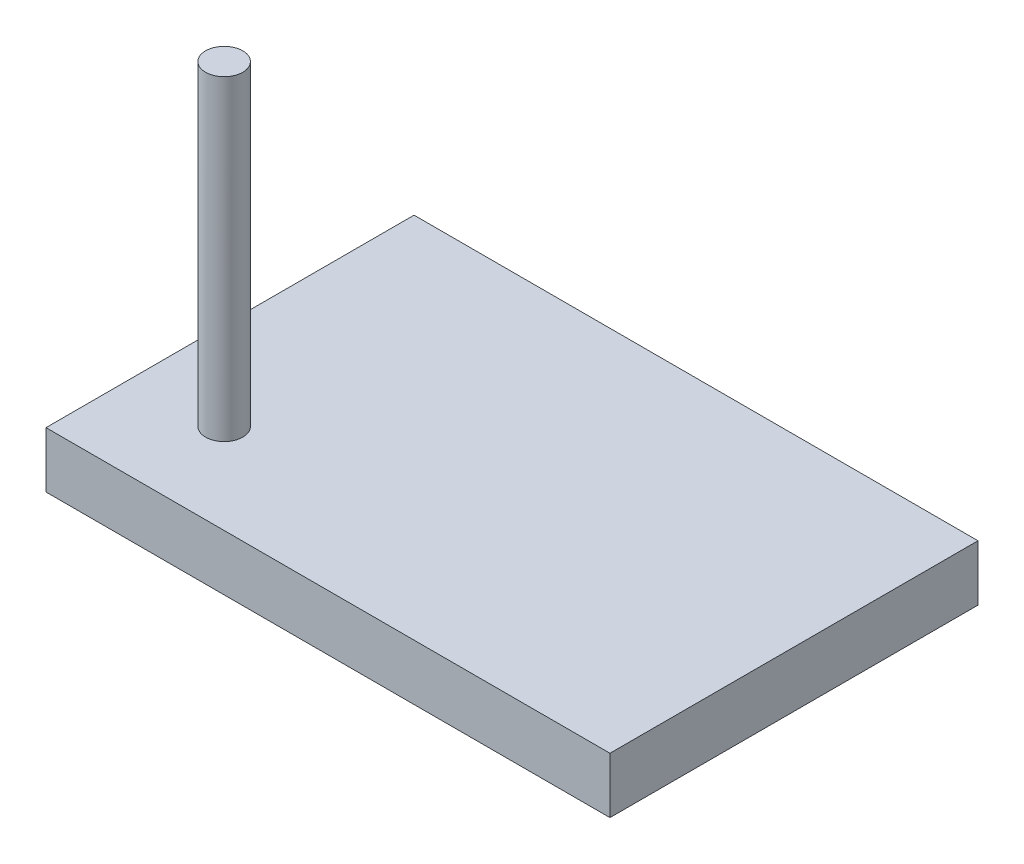
ISO-10303-21;
HEADER;
FILE_DESCRIPTION(('STEP AP214'),'2;1');
FILE_NAME('part.step','',(''),(''),'','','');
FILE_SCHEMA(('AUTOMOTIVE_DESIGN { 1 0 10303 214 1 1 1 1 }'));
ENDSEC;
DATA;
#1=APPLICATION_CONTEXT('core data for automotive mechanical design processes');
#2=APPLICATION_PROTOCOL_DEFINITION('international standard','automotive_design',2000,#1);
#3=PRODUCT_CONTEXT('',#1,'mechanical');
#4=PRODUCT('Part','Part','',(#3));
#5=PRODUCT_RELATED_PRODUCT_CATEGORY('part','',(#4));
#6=PRODUCT_DEFINITION_FORMATION('','',#4);
#7=PRODUCT_DEFINITION_CONTEXT('part definition',#1,'design');
#8=PRODUCT_DEFINITION('design','',#6,#7);
#9=PRODUCT_DEFINITION_SHAPE('','',#8);
#10=(LENGTH_UNIT() NAMED_UNIT(*) SI_UNIT(.MILLI.,.METRE.));
#11=(NAMED_UNIT(*) PLANE_ANGLE_UNIT() SI_UNIT($,.RADIAN.));
#12=(NAMED_UNIT(*) SI_UNIT($,.STERADIAN.) SOLID_ANGLE_UNIT());
#13=UNCERTAINTY_MEASURE_WITH_UNIT(LENGTH_MEASURE(1.E-05),#10,'distance_accuracy_value','');
#14=(GEOMETRIC_REPRESENTATION_CONTEXT(3) GLOBAL_UNCERTAINTY_ASSIGNED_CONTEXT((#13)) GLOBAL_UNIT_ASSIGNED_CONTEXT((#10,
#11,#12)) REPRESENTATION_CONTEXT('',''));
#15=CARTESIAN_POINT('',(0.,0.,0.));
#16=DIRECTION('',(0.,0.,1.));
#17=DIRECTION('',(1.,0.,0.));
#18=AXIS2_PLACEMENT_3D('',#15,#16,#17);
#19=CARTESIAN_POINT('',(75.8382381345163,15.,49.4928260918028));
#20=DIRECTION('',(-1.,0.,0.));
#21=DIRECTION('',(0.,0.,1.));
#22=AXIS2_PLACEMENT_3D('',#19,#20,#21);
#23=PLANE('',#22);
#24=DIRECTION('',(0.,0.,-1.));
#25=VECTOR('',#24,1.);
#26=CARTESIAN_POINT('',(75.8382381345163,0.,49.4928260918028));
#27=LINE('',#26,#25);
#28=CARTESIAN_POINT('',(75.8382381345163,0.,49.4928260918028));
#29=VERTEX_POINT('',#28);
#30=CARTESIAN_POINT('',(75.8382381345163,0.,-49.4928260918028));
#31=VERTEX_POINT('',#30);
#32=EDGE_CURVE('E99',#29,#31,#27,.T.);
#33=ORIENTED_EDGE('',*,*,#32,.T.);
#34=DIRECTION('',(0.,-1.,0.));
#35=VECTOR('',#34,1.);
#36=CARTESIAN_POINT('',(75.8382381345163,15.,-49.4928260918028));
#37=LINE('',#36,#35);
#38=CARTESIAN_POINT('',(75.8382381345163,15.,-49.4928260918028));
#39=VERTEX_POINT('',#38);
#40=EDGE_CURVE('E41',#39,#31,#37,.T.);
#41=ORIENTED_EDGE('',*,*,#40,.F.);
#42=DIRECTION('',(0.,0.,-1.));
#43=VECTOR('',#42,1.);
#44=CARTESIAN_POINT('',(75.8382381345163,15.,49.4928260918028));
#45=LINE('',#44,#43);
#46=CARTESIAN_POINT('',(75.8382381345163,15.,49.4928260918028));
#47=VERTEX_POINT('',#46);
#48=EDGE_CURVE('E85',#47,#39,#45,.T.);
#49=ORIENTED_EDGE('',*,*,#48,.F.);
#50=DIRECTION('',(0.,-1.,0.));
#51=VECTOR('',#50,1.);
#52=CARTESIAN_POINT('',(75.8382381345163,15.,49.4928260918028));
#53=LINE('',#52,#51);
#54=EDGE_CURVE('E95',#47,#29,#53,.T.);
#55=ORIENTED_EDGE('',*,*,#54,.T.);
#56=EDGE_LOOP('',(#33,#41,#49,#55));
#57=FACE_BOUND('',#56,.T.);
#58=ADVANCED_FACE('F33',(#57),#23,.F.);
#59=CARTESIAN_POINT('',(-75.8382381345163,15.,-49.4928260918028));
#60=DIRECTION('',(0.,0.,1.));
#61=DIRECTION('',(1.,0.,0.));
#62=AXIS2_PLACEMENT_3D('',#59,#60,#61);
#63=PLANE('',#62);
#64=DIRECTION('',(-1.,0.,0.));
#65=VECTOR('',#64,1.);
#66=CARTESIAN_POINT('',(-75.8382381345163,0.,-49.4928260918028));
#67=LINE('',#66,#65);
#68=CARTESIAN_POINT('',(-75.8382381345163,0.,-49.4928260918028));
#69=VERTEX_POINT('',#68);
#70=EDGE_CURVE('E90',#31,#69,#67,.T.);
#71=ORIENTED_EDGE('',*,*,#70,.T.);
#72=DIRECTION('',(0.,-1.,0.));
#73=VECTOR('',#72,1.);
#74=CARTESIAN_POINT('',(-75.8382381345163,15.,-49.4928260918028));
#75=LINE('',#74,#73);
#76=CARTESIAN_POINT('',(-75.8382381345163,15.,-49.4928260918028));
#77=VERTEX_POINT('',#76);
#78=EDGE_CURVE('E88',#77,#69,#75,.T.);
#79=ORIENTED_EDGE('',*,*,#78,.F.);
#80=DIRECTION('',(-1.,0.,0.));
#81=VECTOR('',#80,1.);
#82=CARTESIAN_POINT('',(-75.8382381345163,15.,-49.4928260918028));
#83=LINE('',#82,#81);
#84=EDGE_CURVE('E80',#39,#77,#83,.T.);
#85=ORIENTED_EDGE('',*,*,#84,.F.);
#86=ORIENTED_EDGE('',*,*,#40,.T.);
#87=EDGE_LOOP('',(#71,#79,#85,#86));
#88=FACE_BOUND('',#87,.T.);
#89=ADVANCED_FACE('F89',(#88),#63,.F.);
#90=CARTESIAN_POINT('',(-75.8382381345163,15.,49.4928260918028));
#91=DIRECTION('',(1.,0.,0.));
#92=DIRECTION('',(0.,0.,-1.));
#93=AXIS2_PLACEMENT_3D('',#90,#91,#92);
#94=PLANE('',#93);
#95=DIRECTION('',(0.,0.,1.));
#96=VECTOR('',#95,1.);
#97=CARTESIAN_POINT('',(-75.8382381345163,0.,49.4928260918028));
#98=LINE('',#97,#96);
#99=CARTESIAN_POINT('',(-75.8382381345163,0.,49.4928260918028));
#100=VERTEX_POINT('',#99);
#101=EDGE_CURVE('E66',#69,#100,#98,.T.);
#102=ORIENTED_EDGE('',*,*,#101,.T.);
#103=DIRECTION('',(0.,-1.,0.));
#104=VECTOR('',#103,1.);
#105=CARTESIAN_POINT('',(-75.8382381345163,15.,49.4928260918028));
#106=LINE('',#105,#104);
#107=CARTESIAN_POINT('',(-75.8382381345163,15.,49.4928260918028));
#108=VERTEX_POINT('',#107);
#109=EDGE_CURVE('E91',#108,#100,#106,.T.);
#110=ORIENTED_EDGE('',*,*,#109,.F.);
#111=DIRECTION('',(0.,0.,1.));
#112=VECTOR('',#111,1.);
#113=CARTESIAN_POINT('',(-75.8382381345163,15.,49.4928260918028));
#114=LINE('',#113,#112);
#115=EDGE_CURVE('E83',#77,#108,#114,.T.);
#116=ORIENTED_EDGE('',*,*,#115,.F.);
#117=ORIENTED_EDGE('',*,*,#78,.T.);
#118=EDGE_LOOP('',(#102,#110,#116,#117));
#119=FACE_BOUND('',#118,.T.);
#120=ADVANCED_FACE('F93',(#119),#94,.F.);
#121=CARTESIAN_POINT('',(-75.8382381345163,15.,49.4928260918028));
#122=DIRECTION('',(0.,0.,-1.));
#123=DIRECTION('',(-1.,0.,0.));
#124=AXIS2_PLACEMENT_3D('',#121,#122,#123);
#125=PLANE('',#124);
#126=DIRECTION('',(1.,0.,0.));
#127=VECTOR('',#126,1.);
#128=CARTESIAN_POINT('',(-75.8382381345163,0.,49.4928260918028));
#129=LINE('',#128,#127);
#130=EDGE_CURVE('E72',#100,#29,#129,.T.);
#131=ORIENTED_EDGE('',*,*,#130,.T.);
#132=ORIENTED_EDGE('',*,*,#54,.F.);
#133=DIRECTION('',(1.,0.,0.));
#134=VECTOR('',#133,1.);
#135=CARTESIAN_POINT('',(-75.8382381345163,15.,49.4928260918028));
#136=LINE('',#135,#134);
#137=EDGE_CURVE('E49',#108,#47,#136,.T.);
#138=ORIENTED_EDGE('',*,*,#137,.F.);
#139=ORIENTED_EDGE('',*,*,#109,.T.);
#140=EDGE_LOOP('',(#131,#132,#138,#139));
#141=FACE_BOUND('',#140,.T.);
#142=ADVANCED_FACE('F121',(#141),#125,.F.);
#143=CARTESIAN_POINT('',(0.,15.,0.));
#144=DIRECTION('',(0.,-1.,0.));
#145=DIRECTION('',(0.,0.,-1.));
#146=AXIS2_PLACEMENT_3D('',#143,#144,#145);
#147=PLANE('',#146);
#148=CARTESIAN_POINT('',(-52.1538956778613,15.,25.2558589205023));
#149=DIRECTION('',(0.,-1.,0.));
#150=DIRECTION('',(0.,0.,-1.));
#151=AXIS2_PLACEMENT_3D('',#148,#149,#150);
#152=CIRCLE('',#151,5.);
#153=CARTESIAN_POINT('',(-52.1538956778613,15.,20.2558589205023));
#154=VERTEX_POINT('',#153);
#155=EDGE_CURVE('E11',#154,#154,#152,.F.);
#156=ORIENTED_EDGE('',*,*,#155,.F.);
#157=EDGE_LOOP('',(#156));
#158=FACE_BOUND('',#157,.T.);
#159=ORIENTED_EDGE('',*,*,#48,.T.);
#160=ORIENTED_EDGE('',*,*,#84,.T.);
#161=ORIENTED_EDGE('',*,*,#115,.T.);
#162=ORIENTED_EDGE('',*,*,#137,.T.);
#163=EDGE_LOOP('',(#159,#160,#161,#162));
#164=FACE_BOUND('',#163,.T.);
#165=ADVANCED_FACE('F81',(#158,#164),#147,.F.);
#166=CARTESIAN_POINT('',(0.,0.,0.));
#167=DIRECTION('',(0.,-1.,0.));
#168=DIRECTION('',(0.,0.,-1.));
#169=AXIS2_PLACEMENT_3D('',#166,#167,#168);
#170=PLANE('',#169);
#171=ORIENTED_EDGE('',*,*,#32,.F.);
#172=ORIENTED_EDGE('',*,*,#130,.F.);
#173=ORIENTED_EDGE('',*,*,#101,.F.);
#174=ORIENTED_EDGE('',*,*,#70,.F.);
#175=EDGE_LOOP('',(#171,#172,#173,#174));
#176=FACE_BOUND('',#175,.T.);
#177=ADVANCED_FACE('F110',(#176),#170,.T.);
#178=CARTESIAN_POINT('',(-52.1538956778613,100.,25.2558589205023));
#179=DIRECTION('',(0.,-1.,0.));
#180=DIRECTION('',(0.,0.,-1.));
#181=AXIS2_PLACEMENT_3D('',#178,#179,#180);
#182=CYLINDRICAL_SURFACE('',#181,5.);
#183=CARTESIAN_POINT('',(-52.1538956778613,100.,25.2558589205023));
#184=DIRECTION('',(0.,1.,0.));
#185=DIRECTION('',(0.,0.,1.));
#186=AXIS2_PLACEMENT_3D('',#183,#184,#185);
#187=CIRCLE('',#186,5.);
#188=CARTESIAN_POINT('',(-52.1538956778613,100.,30.2558589205023));
#189=VERTEX_POINT('',#188);
#190=EDGE_CURVE('E102',#189,#189,#187,.T.);
#191=ORIENTED_EDGE('',*,*,#190,.F.);
#192=EDGE_LOOP('',(#191));
#193=FACE_BOUND('',#192,.T.);
#194=ORIENTED_EDGE('',*,*,#155,.T.);
#195=EDGE_LOOP('',(#194));
#196=FACE_BOUND('',#195,.T.);
#197=ADVANCED_FACE('F112',(#193,#196),#182,.T.);
#198=CARTESIAN_POINT('',(-52.1538956778613,100.,25.2558589205023));
#199=DIRECTION('',(0.,1.,0.));
#200=DIRECTION('',(0.,0.,1.));
#201=AXIS2_PLACEMENT_3D('',#198,#199,#200);
#202=PLANE('',#201);
#203=ORIENTED_EDGE('',*,*,#190,.T.);
#204=EDGE_LOOP('',(#203));
#205=FACE_BOUND('',#204,.T.);
#206=ADVANCED_FACE('F118',(#205),#202,.T.);
#207=CLOSED_SHELL('',(#58,#89,#120,#142,#165,#177,#197,#206));
#208=MANIFOLD_SOLID_BREP('B2',#207);
#209=ADVANCED_BREP_SHAPE_REPRESENTATION('',(#18,#208),#14);
#210=SHAPE_DEFINITION_REPRESENTATION(#9,#209);
ENDSEC;
END-ISO-10303-21;
